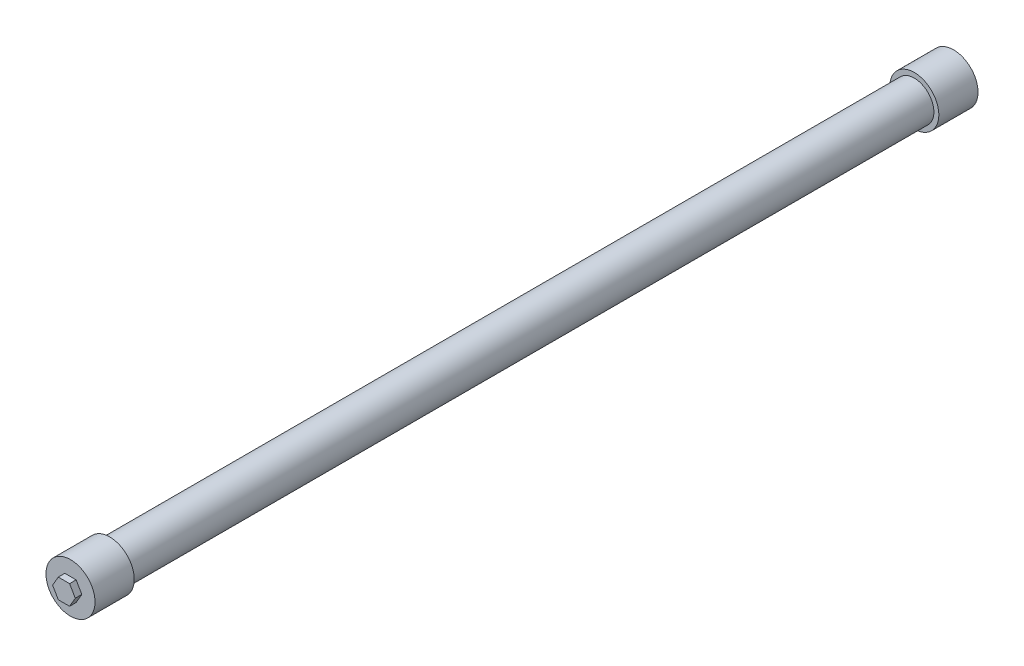
ISO-10303-21;
HEADER;
FILE_DESCRIPTION(('STEP AP214'),'2;1');
FILE_NAME('part.step','',(''),(''),'','','');
FILE_SCHEMA(('AUTOMOTIVE_DESIGN { 1 0 10303 214 1 1 1 1 }'));
ENDSEC;
DATA;
#1=APPLICATION_CONTEXT('core data for automotive mechanical design processes');
#2=APPLICATION_PROTOCOL_DEFINITION('international standard','automotive_design',2000,#1);
#3=PRODUCT_CONTEXT('',#1,'mechanical');
#4=PRODUCT('Part','Part','',(#3));
#5=PRODUCT_RELATED_PRODUCT_CATEGORY('part','',(#4));
#6=PRODUCT_DEFINITION_FORMATION('','',#4);
#7=PRODUCT_DEFINITION_CONTEXT('part definition',#1,'design');
#8=PRODUCT_DEFINITION('design','',#6,#7);
#9=PRODUCT_DEFINITION_SHAPE('','',#8);
#10=(LENGTH_UNIT() NAMED_UNIT(*) SI_UNIT(.MILLI.,.METRE.));
#11=(NAMED_UNIT(*) PLANE_ANGLE_UNIT() SI_UNIT($,.RADIAN.));
#12=(NAMED_UNIT(*) SI_UNIT($,.STERADIAN.) SOLID_ANGLE_UNIT());
#13=UNCERTAINTY_MEASURE_WITH_UNIT(LENGTH_MEASURE(1.E-05),#10,'distance_accuracy_value','');
#14=(GEOMETRIC_REPRESENTATION_CONTEXT(3) GLOBAL_UNCERTAINTY_ASSIGNED_CONTEXT((#13)) GLOBAL_UNIT_ASSIGNED_CONTEXT((#10,
#11,#12)) REPRESENTATION_CONTEXT('',''));
#15=CARTESIAN_POINT('',(0.,0.,0.));
#16=DIRECTION('',(0.,0.,1.));
#17=DIRECTION('',(1.,0.,0.));
#18=AXIS2_PLACEMENT_3D('',#15,#16,#17);
#19=CARTESIAN_POINT('',(0.,0.,-10.));
#20=DIRECTION('',(0.,0.,-1.));
#21=DIRECTION('',(-1.,0.,0.));
#22=AXIS2_PLACEMENT_3D('',#19,#20,#21);
#23=PLANE('',#22);
#24=CARTESIAN_POINT('',(0.,0.,-10.));
#25=DIRECTION('',(0.,0.,-1.));
#26=DIRECTION('',(-1.,0.,0.));
#27=AXIS2_PLACEMENT_3D('',#24,#25,#26);
#28=CIRCLE('',#27,7.5);
#29=CARTESIAN_POINT('',(-7.5,0.,-10.));
#30=VERTEX_POINT('',#29);
#31=EDGE_CURVE('E194',#30,#30,#28,.T.);
#32=ORIENTED_EDGE('',*,*,#31,.T.);
#33=EDGE_LOOP('',(#32));
#34=FACE_BOUND('',#33,.T.);
#35=DIRECTION('',(0.99688737030393,0.0788388922329273,0.));
#36=VECTOR('',#35,1.);
#37=CARTESIAN_POINT('',(-1.96317625148891,2.8541091439519,-10.));
#38=LINE('',#37,#36);
#39=CARTESIAN_POINT('',(-1.96317625148891,2.8541091439519,-10.));
#40=VERTEX_POINT('',#39);
#41=CARTESIAN_POINT('',(1.49014289809135,3.12721507787166,-10.));
#42=VERTEX_POINT('',#41);
#43=EDGE_CURVE('E437',#40,#42,#38,.T.);
#44=ORIENTED_EDGE('',*,*,#43,.F.);
#45=DIRECTION('',(0.430167201672027,0.902749233511532,0.));
#46=VECTOR('',#45,1.);
#47=CARTESIAN_POINT('',(-3.45331914958026,-0.273105933919754,-10.));
#48=LINE('',#47,#46);
#49=CARTESIAN_POINT('',(-3.45331914958026,-0.273105933919754,-10.));
#50=VERTEX_POINT('',#49);
#51=EDGE_CURVE('E146',#50,#40,#48,.T.);
#52=ORIENTED_EDGE('',*,*,#51,.F.);
#53=DIRECTION('',(-0.566720168631904,0.823910341278605,0.));
#54=VECTOR('',#53,1.);
#55=CARTESIAN_POINT('',(-1.49014289809135,-3.12721507787166,-10.));
#56=LINE('',#55,#54);
#57=CARTESIAN_POINT('',(-1.49014289809135,-3.12721507787166,-10.));
#58=VERTEX_POINT('',#57);
#59=EDGE_CURVE('E142',#58,#50,#56,.T.);
#60=ORIENTED_EDGE('',*,*,#59,.F.);
#61=DIRECTION('',(-0.99688737030393,-0.0788388922329269,0.));
#62=VECTOR('',#61,1.);
#63=CARTESIAN_POINT('',(1.96317625148891,-2.85410914395191,-10.));
#64=LINE('',#63,#62);
#65=CARTESIAN_POINT('',(1.96317625148891,-2.85410914395191,-10.));
#66=VERTEX_POINT('',#65);
#67=EDGE_CURVE('E433',#66,#58,#64,.T.);
#68=ORIENTED_EDGE('',*,*,#67,.F.);
#69=DIRECTION('',(-0.430167201672027,-0.902749233511532,0.));
#70=VECTOR('',#69,1.);
#71=CARTESIAN_POINT('',(3.45331914958026,0.273105933919754,-10.));
#72=LINE('',#71,#70);
#73=CARTESIAN_POINT('',(3.45331914958026,0.273105933919754,-10.));
#74=VERTEX_POINT('',#73);
#75=EDGE_CURVE('E445',#74,#66,#72,.T.);
#76=ORIENTED_EDGE('',*,*,#75,.F.);
#77=DIRECTION('',(0.566720168631904,-0.823910341278605,0.));
#78=VECTOR('',#77,1.);
#79=CARTESIAN_POINT('',(1.49014289809135,3.12721507787166,-10.));
#80=LINE('',#79,#78);
#81=EDGE_CURVE('E439',#42,#74,#80,.T.);
#82=ORIENTED_EDGE('',*,*,#81,.F.);
#83=EDGE_LOOP('',(#44,#52,#60,#68,#76,#82));
#84=FACE_BOUND('',#83,.T.);
#85=ADVANCED_FACE('F33',(#34,#84),#23,.T.);
#86=CARTESIAN_POINT('',(0.,0.,260.));
#87=DIRECTION('',(0.,0.,1.));
#88=DIRECTION('',(1.,0.,0.));
#89=AXIS2_PLACEMENT_3D('',#86,#87,#88);
#90=PLANE('',#89);
#91=CARTESIAN_POINT('',(0.,0.,260.));
#92=DIRECTION('',(0.,0.,1.));
#93=DIRECTION('',(1.,0.,0.));
#94=AXIS2_PLACEMENT_3D('',#91,#92,#93);
#95=CIRCLE('',#94,7.5);
#96=CARTESIAN_POINT('',(7.5,0.,260.));
#97=VERTEX_POINT('',#96);
#98=EDGE_CURVE('E200',#97,#97,#95,.T.);
#99=ORIENTED_EDGE('',*,*,#98,.T.);
#100=EDGE_LOOP('',(#99));
#101=FACE_BOUND('',#100,.T.);
#102=DIRECTION('',(-0.5,0.866025403784439,0.));
#103=VECTOR('',#102,1.);
#104=CARTESIAN_POINT('',(3.46410161513776,0.,260.));
#105=LINE('',#104,#103);
#106=CARTESIAN_POINT('',(3.46410161513776,0.,260.));
#107=VERTEX_POINT('',#106);
#108=CARTESIAN_POINT('',(1.73205080756888,3.,260.));
#109=VERTEX_POINT('',#108);
#110=EDGE_CURVE('E151',#107,#109,#105,.T.);
#111=ORIENTED_EDGE('',*,*,#110,.F.);
#112=DIRECTION('',(0.5,0.866025403784439,0.));
#113=VECTOR('',#112,1.);
#114=CARTESIAN_POINT('',(1.73205080756888,-3.,260.));
#115=LINE('',#114,#113);
#116=CARTESIAN_POINT('',(1.73205080756888,-3.,260.));
#117=VERTEX_POINT('',#116);
#118=EDGE_CURVE('E148',#117,#107,#115,.T.);
#119=ORIENTED_EDGE('',*,*,#118,.F.);
#120=DIRECTION('',(1.,0.,0.));
#121=VECTOR('',#120,1.);
#122=CARTESIAN_POINT('',(-1.73205080756888,-3.,260.));
#123=LINE('',#122,#121);
#124=CARTESIAN_POINT('',(-1.73205080756888,-3.,260.));
#125=VERTEX_POINT('',#124);
#126=EDGE_CURVE('E161',#125,#117,#123,.T.);
#127=ORIENTED_EDGE('',*,*,#126,.F.);
#128=DIRECTION('',(0.5,-0.866025403784439,0.));
#129=VECTOR('',#128,1.);
#130=CARTESIAN_POINT('',(-3.46410161513776,0.,260.));
#131=LINE('',#130,#129);
#132=CARTESIAN_POINT('',(-3.46410161513776,0.,260.));
#133=VERTEX_POINT('',#132);
#134=EDGE_CURVE('E177',#133,#125,#131,.T.);
#135=ORIENTED_EDGE('',*,*,#134,.F.);
#136=DIRECTION('',(-0.5,-0.866025403784439,0.));
#137=VECTOR('',#136,1.);
#138=CARTESIAN_POINT('',(-1.73205080756888,3.,260.));
#139=LINE('',#138,#137);
#140=CARTESIAN_POINT('',(-1.73205080756888,3.,260.));
#141=VERTEX_POINT('',#140);
#142=EDGE_CURVE('E175',#141,#133,#139,.T.);
#143=ORIENTED_EDGE('',*,*,#142,.F.);
#144=DIRECTION('',(-1.,0.,0.));
#145=VECTOR('',#144,1.);
#146=CARTESIAN_POINT('',(1.73205080756888,3.,260.));
#147=LINE('',#146,#145);
#148=EDGE_CURVE('E173',#109,#141,#147,.T.);
#149=ORIENTED_EDGE('',*,*,#148,.F.);
#150=EDGE_LOOP('',(#111,#119,#127,#135,#143,#149));
#151=FACE_BOUND('',#150,.T.);
#152=ADVANCED_FACE('F212',(#101,#151),#90,.T.);
#153=CARTESIAN_POINT('',(0.,0.,250.));
#154=DIRECTION('',(0.,0.,-1.));
#155=DIRECTION('',(-1.,0.,0.));
#156=AXIS2_PLACEMENT_3D('',#153,#154,#155);
#157=CYLINDRICAL_SURFACE('',#156,6.);
#158=CARTESIAN_POINT('',(0.,0.,248.));
#159=DIRECTION('',(0.,0.,1.));
#160=DIRECTION('',(1.,0.,0.));
#161=AXIS2_PLACEMENT_3D('',#158,#159,#160);
#162=CIRCLE('',#161,6.);
#163=CARTESIAN_POINT('',(6.,0.,248.));
#164=VERTEX_POINT('',#163);
#165=EDGE_CURVE('E41',#164,#164,#162,.T.);
#166=ORIENTED_EDGE('',*,*,#165,.F.);
#167=EDGE_LOOP('',(#166));
#168=FACE_BOUND('',#167,.T.);
#169=CARTESIAN_POINT('',(0.,0.,2.));
#170=DIRECTION('',(0.,0.,-1.));
#171=DIRECTION('',(-1.,0.,0.));
#172=AXIS2_PLACEMENT_3D('',#169,#170,#171);
#173=CIRCLE('',#172,6.);
#174=CARTESIAN_POINT('',(-6.,0.,2.));
#175=VERTEX_POINT('',#174);
#176=EDGE_CURVE('E11',#175,#175,#173,.T.);
#177=ORIENTED_EDGE('',*,*,#176,.F.);
#178=EDGE_LOOP('',(#177));
#179=FACE_BOUND('',#178,.T.);
#180=ADVANCED_FACE('F35',(#168,#179),#157,.T.);
#181=CARTESIAN_POINT('',(0.,0.,248.));
#182=DIRECTION('',(0.,0.,1.));
#183=DIRECTION('',(1.,0.,0.));
#184=AXIS2_PLACEMENT_3D('',#181,#182,#183);
#185=PLANE('',#184);
#186=CARTESIAN_POINT('',(0.,0.,248.));
#187=DIRECTION('',(0.,0.,1.));
#188=DIRECTION('',(1.,0.,0.));
#189=AXIS2_PLACEMENT_3D('',#186,#187,#188);
#190=CIRCLE('',#189,7.5);
#191=CARTESIAN_POINT('',(7.5,0.,248.));
#192=VERTEX_POINT('',#191);
#193=EDGE_CURVE('E203',#192,#192,#190,.T.);
#194=ORIENTED_EDGE('',*,*,#193,.F.);
#195=EDGE_LOOP('',(#194));
#196=FACE_BOUND('',#195,.T.);
#197=ORIENTED_EDGE('',*,*,#165,.T.);
#198=EDGE_LOOP('',(#197));
#199=FACE_BOUND('',#198,.T.);
#200=ADVANCED_FACE('F208',(#196,#199),#185,.F.);
#201=CARTESIAN_POINT('',(0.,0.,248.));
#202=DIRECTION('',(0.,0.,1.));
#203=DIRECTION('',(1.,0.,0.));
#204=AXIS2_PLACEMENT_3D('',#201,#202,#203);
#205=CYLINDRICAL_SURFACE('',#204,7.5);
#206=ORIENTED_EDGE('',*,*,#193,.T.);
#207=EDGE_LOOP('',(#206));
#208=FACE_BOUND('',#207,.T.);
#209=ORIENTED_EDGE('',*,*,#98,.F.);
#210=EDGE_LOOP('',(#209));
#211=FACE_BOUND('',#210,.T.);
#212=ADVANCED_FACE('F218',(#208,#211),#205,.T.);
#213=CARTESIAN_POINT('',(0.,0.,2.));
#214=DIRECTION('',(0.,0.,-1.));
#215=DIRECTION('',(-1.,0.,0.));
#216=AXIS2_PLACEMENT_3D('',#213,#214,#215);
#217=PLANE('',#216);
#218=CARTESIAN_POINT('',(0.,0.,2.));
#219=DIRECTION('',(0.,0.,-1.));
#220=DIRECTION('',(-1.,0.,0.));
#221=AXIS2_PLACEMENT_3D('',#218,#219,#220);
#222=CIRCLE('',#221,7.5);
#223=CARTESIAN_POINT('',(-7.5,0.,2.));
#224=VERTEX_POINT('',#223);
#225=EDGE_CURVE('E197',#224,#224,#222,.T.);
#226=ORIENTED_EDGE('',*,*,#225,.F.);
#227=EDGE_LOOP('',(#226));
#228=FACE_BOUND('',#227,.T.);
#229=ORIENTED_EDGE('',*,*,#176,.T.);
#230=EDGE_LOOP('',(#229));
#231=FACE_BOUND('',#230,.T.);
#232=ADVANCED_FACE('F215',(#228,#231),#217,.F.);
#233=CARTESIAN_POINT('',(0.,0.,2.));
#234=DIRECTION('',(0.,0.,-1.));
#235=DIRECTION('',(-1.,0.,0.));
#236=AXIS2_PLACEMENT_3D('',#233,#234,#235);
#237=CYLINDRICAL_SURFACE('',#236,7.5);
#238=ORIENTED_EDGE('',*,*,#225,.T.);
#239=EDGE_LOOP('',(#238));
#240=FACE_BOUND('',#239,.T.);
#241=ORIENTED_EDGE('',*,*,#31,.F.);
#242=EDGE_LOOP('',(#241));
#243=FACE_BOUND('',#242,.T.);
#244=ADVANCED_FACE('F217',(#240,#243),#237,.T.);
#245=CARTESIAN_POINT('',(1.73205080756888,-3.,262.));
#246=DIRECTION('',(-0.866025403784439,0.5,0.));
#247=DIRECTION('',(-0.5,-0.866025403784439,0.));
#248=AXIS2_PLACEMENT_3D('',#245,#246,#247);
#249=PLANE('',#248);
#250=ORIENTED_EDGE('',*,*,#118,.T.);
#251=DIRECTION('',(0.,0.,-1.));
#252=VECTOR('',#251,1.);
#253=CARTESIAN_POINT('',(3.46410161513776,0.,262.));
#254=LINE('',#253,#252);
#255=CARTESIAN_POINT('',(3.46410161513776,0.,262.));
#256=VERTEX_POINT('',#255);
#257=EDGE_CURVE('E192',#256,#107,#254,.T.);
#258=ORIENTED_EDGE('',*,*,#257,.F.);
#259=DIRECTION('',(0.5,0.866025403784439,0.));
#260=VECTOR('',#259,1.);
#261=CARTESIAN_POINT('',(1.73205080756888,-3.,262.));
#262=LINE('',#261,#260);
#263=CARTESIAN_POINT('',(1.73205080756888,-3.,262.));
#264=VERTEX_POINT('',#263);
#265=EDGE_CURVE('E157',#264,#256,#262,.T.);
#266=ORIENTED_EDGE('',*,*,#265,.F.);
#267=DIRECTION('',(0.,0.,-1.));
#268=VECTOR('',#267,1.);
#269=CARTESIAN_POINT('',(1.73205080756888,-3.,262.));
#270=LINE('',#269,#268);
#271=EDGE_CURVE('E170',#264,#117,#270,.T.);
#272=ORIENTED_EDGE('',*,*,#271,.T.);
#273=EDGE_LOOP('',(#250,#258,#266,#272));
#274=FACE_BOUND('',#273,.T.);
#275=ADVANCED_FACE('F225',(#274),#249,.F.);
#276=CARTESIAN_POINT('',(3.46410161513776,0.,262.));
#277=DIRECTION('',(-0.866025403784439,-0.5,0.));
#278=DIRECTION('',(0.5,-0.866025403784439,0.));
#279=AXIS2_PLACEMENT_3D('',#276,#277,#278);
#280=PLANE('',#279);
#281=ORIENTED_EDGE('',*,*,#110,.T.);
#282=DIRECTION('',(0.,0.,-1.));
#283=VECTOR('',#282,1.);
#284=CARTESIAN_POINT('',(1.73205080756888,3.,262.));
#285=LINE('',#284,#283);
#286=CARTESIAN_POINT('',(1.73205080756888,3.,262.));
#287=VERTEX_POINT('',#286);
#288=EDGE_CURVE('E189',#287,#109,#285,.T.);
#289=ORIENTED_EDGE('',*,*,#288,.F.);
#290=DIRECTION('',(-0.5,0.866025403784439,0.));
#291=VECTOR('',#290,1.);
#292=CARTESIAN_POINT('',(3.46410161513776,0.,262.));
#293=LINE('',#292,#291);
#294=EDGE_CURVE('E160',#256,#287,#293,.T.);
#295=ORIENTED_EDGE('',*,*,#294,.F.);
#296=ORIENTED_EDGE('',*,*,#257,.T.);
#297=EDGE_LOOP('',(#281,#289,#295,#296));
#298=FACE_BOUND('',#297,.T.);
#299=ADVANCED_FACE('F242',(#298),#280,.F.);
#300=CARTESIAN_POINT('',(1.73205080756888,3.,262.));
#301=DIRECTION('',(0.,-1.,0.));
#302=DIRECTION('',(1.,0.,0.));
#303=AXIS2_PLACEMENT_3D('',#300,#301,#302);
#304=PLANE('',#303);
#305=ORIENTED_EDGE('',*,*,#148,.T.);
#306=DIRECTION('',(0.,0.,-1.));
#307=VECTOR('',#306,1.);
#308=CARTESIAN_POINT('',(-1.73205080756888,3.,262.));
#309=LINE('',#308,#307);
#310=CARTESIAN_POINT('',(-1.73205080756888,3.,262.));
#311=VERTEX_POINT('',#310);
#312=EDGE_CURVE('E186',#311,#141,#309,.T.);
#313=ORIENTED_EDGE('',*,*,#312,.F.);
#314=DIRECTION('',(-1.,0.,0.));
#315=VECTOR('',#314,1.);
#316=CARTESIAN_POINT('',(1.73205080756888,3.,262.));
#317=LINE('',#316,#315);
#318=EDGE_CURVE('E163',#287,#311,#317,.T.);
#319=ORIENTED_EDGE('',*,*,#318,.F.);
#320=ORIENTED_EDGE('',*,*,#288,.T.);
#321=EDGE_LOOP('',(#305,#313,#319,#320));
#322=FACE_BOUND('',#321,.T.);
#323=ADVANCED_FACE('F246',(#322),#304,.F.);
#324=CARTESIAN_POINT('',(-1.73205080756888,3.,262.));
#325=DIRECTION('',(0.866025403784439,-0.5,0.));
#326=DIRECTION('',(0.5,0.866025403784439,0.));
#327=AXIS2_PLACEMENT_3D('',#324,#325,#326);
#328=PLANE('',#327);
#329=ORIENTED_EDGE('',*,*,#142,.T.);
#330=DIRECTION('',(0.,0.,-1.));
#331=VECTOR('',#330,1.);
#332=CARTESIAN_POINT('',(-3.46410161513776,0.,262.));
#333=LINE('',#332,#331);
#334=CARTESIAN_POINT('',(-3.46410161513776,0.,262.));
#335=VERTEX_POINT('',#334);
#336=EDGE_CURVE('E183',#335,#133,#333,.T.);
#337=ORIENTED_EDGE('',*,*,#336,.F.);
#338=DIRECTION('',(-0.5,-0.866025403784439,0.));
#339=VECTOR('',#338,1.);
#340=CARTESIAN_POINT('',(-1.73205080756888,3.,262.));
#341=LINE('',#340,#339);
#342=EDGE_CURVE('E165',#311,#335,#341,.T.);
#343=ORIENTED_EDGE('',*,*,#342,.F.);
#344=ORIENTED_EDGE('',*,*,#312,.T.);
#345=EDGE_LOOP('',(#329,#337,#343,#344));
#346=FACE_BOUND('',#345,.T.);
#347=ADVANCED_FACE('F250',(#346),#328,.F.);
#348=CARTESIAN_POINT('',(-3.46410161513776,0.,262.));
#349=DIRECTION('',(0.866025403784439,0.5,0.));
#350=DIRECTION('',(-0.5,0.866025403784439,0.));
#351=AXIS2_PLACEMENT_3D('',#348,#349,#350);
#352=PLANE('',#351);
#353=ORIENTED_EDGE('',*,*,#134,.T.);
#354=DIRECTION('',(0.,0.,-1.));
#355=VECTOR('',#354,1.);
#356=CARTESIAN_POINT('',(-1.73205080756888,-3.,262.));
#357=LINE('',#356,#355);
#358=CARTESIAN_POINT('',(-1.73205080756888,-3.,262.));
#359=VERTEX_POINT('',#358);
#360=EDGE_CURVE('E56',#359,#125,#357,.T.);
#361=ORIENTED_EDGE('',*,*,#360,.F.);
#362=DIRECTION('',(0.5,-0.866025403784439,0.));
#363=VECTOR('',#362,1.);
#364=CARTESIAN_POINT('',(-3.46410161513776,0.,262.));
#365=LINE('',#364,#363);
#366=EDGE_CURVE('E167',#335,#359,#365,.T.);
#367=ORIENTED_EDGE('',*,*,#366,.F.);
#368=ORIENTED_EDGE('',*,*,#336,.T.);
#369=EDGE_LOOP('',(#353,#361,#367,#368));
#370=FACE_BOUND('',#369,.T.);
#371=ADVANCED_FACE('F254',(#370),#352,.F.);
#372=CARTESIAN_POINT('',(-1.73205080756888,-3.,262.));
#373=DIRECTION('',(0.,1.,0.));
#374=DIRECTION('',(0.,0.,1.));
#375=AXIS2_PLACEMENT_3D('',#372,#373,#374);
#376=PLANE('',#375);
#377=ORIENTED_EDGE('',*,*,#126,.T.);
#378=ORIENTED_EDGE('',*,*,#271,.F.);
#379=DIRECTION('',(1.,0.,0.));
#380=VECTOR('',#379,1.);
#381=CARTESIAN_POINT('',(-1.73205080756888,-3.,262.));
#382=LINE('',#381,#380);
#383=EDGE_CURVE('E169',#359,#264,#382,.T.);
#384=ORIENTED_EDGE('',*,*,#383,.F.);
#385=ORIENTED_EDGE('',*,*,#360,.T.);
#386=EDGE_LOOP('',(#377,#378,#384,#385));
#387=FACE_BOUND('',#386,.T.);
#388=ADVANCED_FACE('F258',(#387),#376,.F.);
#389=CARTESIAN_POINT('',(0.,0.,262.));
#390=DIRECTION('',(0.,0.,1.));
#391=DIRECTION('',(1.,0.,0.));
#392=AXIS2_PLACEMENT_3D('',#389,#390,#391);
#393=PLANE('',#392);
#394=ORIENTED_EDGE('',*,*,#265,.T.);
#395=ORIENTED_EDGE('',*,*,#294,.T.);
#396=ORIENTED_EDGE('',*,*,#318,.T.);
#397=ORIENTED_EDGE('',*,*,#342,.T.);
#398=ORIENTED_EDGE('',*,*,#366,.T.);
#399=ORIENTED_EDGE('',*,*,#383,.T.);
#400=EDGE_LOOP('',(#394,#395,#396,#397,#398,#399));
#401=FACE_BOUND('',#400,.T.);
#402=ADVANCED_FACE('F262',(#401),#393,.T.);
#403=CARTESIAN_POINT('',(-3.45331914958026,-0.273105933919754,-12.));
#404=DIRECTION('',(0.902749233511532,-0.430167201672027,0.));
#405=DIRECTION('',(0.430167201672027,0.902749233511532,0.));
#406=AXIS2_PLACEMENT_3D('',#403,#404,#405);
#407=PLANE('',#406);
#408=ORIENTED_EDGE('',*,*,#51,.T.);
#409=DIRECTION('',(0.,0.,1.));
#410=VECTOR('',#409,1.);
#411=CARTESIAN_POINT('',(-1.96317625148891,2.8541091439519,-12.));
#412=LINE('',#411,#410);
#413=CARTESIAN_POINT('',(-1.96317625148891,2.8541091439519,-12.));
#414=VERTEX_POINT('',#413);
#415=EDGE_CURVE('E127',#414,#40,#412,.T.);
#416=ORIENTED_EDGE('',*,*,#415,.F.);
#417=DIRECTION('',(0.430167201672027,0.902749233511532,0.));
#418=VECTOR('',#417,1.);
#419=CARTESIAN_POINT('',(-3.45331914958026,-0.273105933919754,-12.));
#420=LINE('',#419,#418);
#421=CARTESIAN_POINT('',(-3.45331914958026,-0.273105933919754,-12.));
#422=VERTEX_POINT('',#421);
#423=EDGE_CURVE('E134',#422,#414,#420,.T.);
#424=ORIENTED_EDGE('',*,*,#423,.F.);
#425=DIRECTION('',(0.,0.,1.));
#426=VECTOR('',#425,1.);
#427=CARTESIAN_POINT('',(-3.45331914958026,-0.273105933919754,-12.));
#428=LINE('',#427,#426);
#429=EDGE_CURVE('E431',#422,#50,#428,.T.);
#430=ORIENTED_EDGE('',*,*,#429,.T.);
#431=EDGE_LOOP('',(#408,#416,#424,#430));
#432=FACE_BOUND('',#431,.T.);
#433=ADVANCED_FACE('F144',(#432),#407,.F.);
#434=CARTESIAN_POINT('',(-1.96317625148891,2.8541091439519,-12.));
#435=DIRECTION('',(0.0788388922329273,-0.99688737030393,0.));
#436=DIRECTION('',(0.99688737030393,0.0788388922329273,0.));
#437=AXIS2_PLACEMENT_3D('',#434,#435,#436);
#438=PLANE('',#437);
#439=ORIENTED_EDGE('',*,*,#43,.T.);
#440=DIRECTION('',(0.,0.,1.));
#441=VECTOR('',#440,1.);
#442=CARTESIAN_POINT('',(1.49014289809135,3.12721507787166,-12.));
#443=LINE('',#442,#441);
#444=CARTESIAN_POINT('',(1.49014289809135,3.12721507787166,-12.));
#445=VERTEX_POINT('',#444);
#446=EDGE_CURVE('E130',#445,#42,#443,.T.);
#447=ORIENTED_EDGE('',*,*,#446,.F.);
#448=DIRECTION('',(0.99688737030393,0.0788388922329273,0.));
#449=VECTOR('',#448,1.);
#450=CARTESIAN_POINT('',(-1.96317625148891,2.8541091439519,-12.));
#451=LINE('',#450,#449);
#452=EDGE_CURVE('E123',#414,#445,#451,.T.);
#453=ORIENTED_EDGE('',*,*,#452,.F.);
#454=ORIENTED_EDGE('',*,*,#415,.T.);
#455=EDGE_LOOP('',(#439,#447,#453,#454));
#456=FACE_BOUND('',#455,.T.);
#457=ADVANCED_FACE('F125',(#456),#438,.F.);
#458=CARTESIAN_POINT('',(1.49014289809135,3.12721507787166,-12.));
#459=DIRECTION('',(-0.823910341278605,-0.566720168631904,0.));
#460=DIRECTION('',(0.566720168631904,-0.823910341278605,0.));
#461=AXIS2_PLACEMENT_3D('',#458,#459,#460);
#462=PLANE('',#461);
#463=ORIENTED_EDGE('',*,*,#81,.T.);
#464=DIRECTION('',(0.,0.,1.));
#465=VECTOR('',#464,1.);
#466=CARTESIAN_POINT('',(3.45331914958026,0.273105933919754,-12.));
#467=LINE('',#466,#465);
#468=CARTESIAN_POINT('',(3.45331914958026,0.273105933919754,-12.));
#469=VERTEX_POINT('',#468);
#470=EDGE_CURVE('E153',#469,#74,#467,.T.);
#471=ORIENTED_EDGE('',*,*,#470,.F.);
#472=DIRECTION('',(0.566720168631904,-0.823910341278605,0.));
#473=VECTOR('',#472,1.);
#474=CARTESIAN_POINT('',(1.49014289809135,3.12721507787166,-12.));
#475=LINE('',#474,#473);
#476=EDGE_CURVE('E133',#445,#469,#475,.T.);
#477=ORIENTED_EDGE('',*,*,#476,.F.);
#478=ORIENTED_EDGE('',*,*,#446,.T.);
#479=EDGE_LOOP('',(#463,#471,#477,#478));
#480=FACE_BOUND('',#479,.T.);
#481=ADVANCED_FACE('F270',(#480),#462,.F.);
#482=CARTESIAN_POINT('',(3.45331914958026,0.273105933919754,-12.));
#483=DIRECTION('',(-0.902749233511532,0.430167201672027,0.));
#484=DIRECTION('',(-0.430167201672027,-0.902749233511532,0.));
#485=AXIS2_PLACEMENT_3D('',#482,#483,#484);
#486=PLANE('',#485);
#487=ORIENTED_EDGE('',*,*,#75,.T.);
#488=DIRECTION('',(0.,0.,1.));
#489=VECTOR('',#488,1.);
#490=CARTESIAN_POINT('',(1.96317625148891,-2.85410914395191,-12.));
#491=LINE('',#490,#489);
#492=CARTESIAN_POINT('',(1.96317625148891,-2.85410914395191,-12.));
#493=VERTEX_POINT('',#492);
#494=EDGE_CURVE('E449',#493,#66,#491,.T.);
#495=ORIENTED_EDGE('',*,*,#494,.F.);
#496=DIRECTION('',(-0.430167201672027,-0.902749233511532,0.));
#497=VECTOR('',#496,1.);
#498=CARTESIAN_POINT('',(3.45331914958026,0.273105933919754,-12.));
#499=LINE('',#498,#497);
#500=EDGE_CURVE('E456',#469,#493,#499,.T.);
#501=ORIENTED_EDGE('',*,*,#500,.F.);
#502=ORIENTED_EDGE('',*,*,#470,.T.);
#503=EDGE_LOOP('',(#487,#495,#501,#502));
#504=FACE_BOUND('',#503,.T.);
#505=ADVANCED_FACE('F273',(#504),#486,.F.);
#506=CARTESIAN_POINT('',(1.96317625148891,-2.85410914395191,-12.));
#507=DIRECTION('',(-0.0788388922329269,0.99688737030393,0.));
#508=DIRECTION('',(-0.99688737030393,-0.0788388922329269,0.));
#509=AXIS2_PLACEMENT_3D('',#506,#507,#508);
#510=PLANE('',#509);
#511=ORIENTED_EDGE('',*,*,#67,.T.);
#512=DIRECTION('',(0.,0.,1.));
#513=VECTOR('',#512,1.);
#514=CARTESIAN_POINT('',(-1.49014289809135,-3.12721507787166,-12.));
#515=LINE('',#514,#513);
#516=CARTESIAN_POINT('',(-1.49014289809135,-3.12721507787166,-12.));
#517=VERTEX_POINT('',#516);
#518=EDGE_CURVE('E48',#517,#58,#515,.T.);
#519=ORIENTED_EDGE('',*,*,#518,.F.);
#520=DIRECTION('',(-0.99688737030393,-0.0788388922329269,0.));
#521=VECTOR('',#520,1.);
#522=CARTESIAN_POINT('',(1.96317625148891,-2.85410914395191,-12.));
#523=LINE('',#522,#521);
#524=EDGE_CURVE('E458',#493,#517,#523,.T.);
#525=ORIENTED_EDGE('',*,*,#524,.F.);
#526=ORIENTED_EDGE('',*,*,#494,.T.);
#527=EDGE_LOOP('',(#511,#519,#525,#526));
#528=FACE_BOUND('',#527,.T.);
#529=ADVANCED_FACE('F277',(#528),#510,.F.);
#530=CARTESIAN_POINT('',(-1.49014289809135,-3.12721507787166,-12.));
#531=DIRECTION('',(0.823910341278605,0.566720168631904,0.));
#532=DIRECTION('',(-0.566720168631904,0.823910341278605,0.));
#533=AXIS2_PLACEMENT_3D('',#530,#531,#532);
#534=PLANE('',#533);
#535=ORIENTED_EDGE('',*,*,#59,.T.);
#536=ORIENTED_EDGE('',*,*,#429,.F.);
#537=DIRECTION('',(-0.566720168631904,0.823910341278605,0.));
#538=VECTOR('',#537,1.);
#539=CARTESIAN_POINT('',(-1.49014289809135,-3.12721507787166,-12.));
#540=LINE('',#539,#538);
#541=EDGE_CURVE('E138',#517,#422,#540,.T.);
#542=ORIENTED_EDGE('',*,*,#541,.F.);
#543=ORIENTED_EDGE('',*,*,#518,.T.);
#544=EDGE_LOOP('',(#535,#536,#542,#543));
#545=FACE_BOUND('',#544,.T.);
#546=ADVANCED_FACE('F281',(#545),#534,.F.);
#547=CARTESIAN_POINT('',(0.,0.,-12.));
#548=DIRECTION('',(0.,0.,-1.));
#549=DIRECTION('',(-1.,0.,0.));
#550=AXIS2_PLACEMENT_3D('',#547,#548,#549);
#551=PLANE('',#550);
#552=ORIENTED_EDGE('',*,*,#423,.T.);
#553=ORIENTED_EDGE('',*,*,#452,.T.);
#554=ORIENTED_EDGE('',*,*,#476,.T.);
#555=ORIENTED_EDGE('',*,*,#500,.T.);
#556=ORIENTED_EDGE('',*,*,#524,.T.);
#557=ORIENTED_EDGE('',*,*,#541,.T.);
#558=EDGE_LOOP('',(#552,#553,#554,#555,#556,#557));
#559=FACE_BOUND('',#558,.T.);
#560=ADVANCED_FACE('F137',(#559),#551,.T.);
#561=CLOSED_SHELL('',(#85,#152,#180,#200,#212,#232,#244,#275,#299,#323,#347,#371,#388,#402,#433,
#457,#481,#505,#529,#546,#560));
#562=MANIFOLD_SOLID_BREP('B2',#561);
#563=ADVANCED_BREP_SHAPE_REPRESENTATION('',(#18,#562),#14);
#564=SHAPE_DEFINITION_REPRESENTATION(#9,#563);
ENDSEC;
END-ISO-10303-21;
